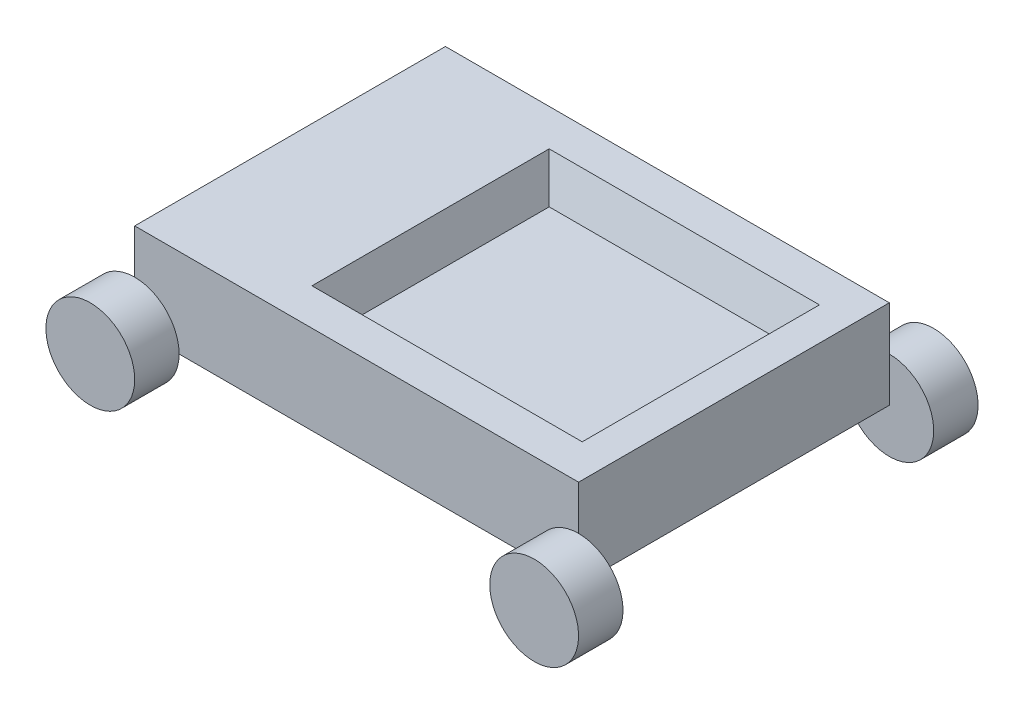
ISO-10303-21;
HEADER;
FILE_DESCRIPTION(('STEP AP214'),'2;1');
FILE_NAME('part.step','',(''),(''),'','','');
FILE_SCHEMA(('AUTOMOTIVE_DESIGN { 1 0 10303 214 1 1 1 1 }'));
ENDSEC;
DATA;
#1=APPLICATION_CONTEXT('core data for automotive mechanical design processes');
#2=APPLICATION_PROTOCOL_DEFINITION('international standard','automotive_design',2000,#1);
#3=PRODUCT_CONTEXT('',#1,'mechanical');
#4=PRODUCT('Part','Part','',(#3));
#5=PRODUCT_RELATED_PRODUCT_CATEGORY('part','',(#4));
#6=PRODUCT_DEFINITION_FORMATION('','',#4);
#7=PRODUCT_DEFINITION_CONTEXT('part definition',#1,'design');
#8=PRODUCT_DEFINITION('design','',#6,#7);
#9=PRODUCT_DEFINITION_SHAPE('','',#8);
#10=(LENGTH_UNIT() NAMED_UNIT(*) SI_UNIT(.MILLI.,.METRE.));
#11=(NAMED_UNIT(*) PLANE_ANGLE_UNIT() SI_UNIT($,.RADIAN.));
#12=(NAMED_UNIT(*) SI_UNIT($,.STERADIAN.) SOLID_ANGLE_UNIT());
#13=UNCERTAINTY_MEASURE_WITH_UNIT(LENGTH_MEASURE(1.E-05),#10,'distance_accuracy_value','');
#14=(GEOMETRIC_REPRESENTATION_CONTEXT(3) GLOBAL_UNCERTAINTY_ASSIGNED_CONTEXT((#13)) GLOBAL_UNIT_ASSIGNED_CONTEXT((#10,
#11,#12)) REPRESENTATION_CONTEXT('',''));
#15=CARTESIAN_POINT('',(0.,0.,0.));
#16=DIRECTION('',(0.,0.,1.));
#17=DIRECTION('',(1.,0.,0.));
#18=AXIS2_PLACEMENT_3D('',#15,#16,#17);
#19=CARTESIAN_POINT('',(-500.,200.,350.));
#20=DIRECTION('',(1.,0.,0.));
#21=DIRECTION('',(0.,0.,-1.));
#22=AXIS2_PLACEMENT_3D('',#19,#20,#21);
#23=PLANE('',#22);
#24=DIRECTION('',(0.,0.,1.));
#25=VECTOR('',#24,1.);
#26=CARTESIAN_POINT('',(-500.,0.,350.));
#27=LINE('',#26,#25);
#28=CARTESIAN_POINT('',(-500.,0.,-350.));
#29=VERTEX_POINT('',#28);
#30=CARTESIAN_POINT('',(-500.,0.,350.));
#31=VERTEX_POINT('',#30);
#32=EDGE_CURVE('E191',#29,#31,#27,.T.);
#33=ORIENTED_EDGE('',*,*,#32,.T.);
#34=DIRECTION('',(0.,-1.,0.));
#35=VECTOR('',#34,1.);
#36=CARTESIAN_POINT('',(-500.,200.,350.));
#37=LINE('',#36,#35);
#38=CARTESIAN_POINT('',(-500.,100.,350.));
#39=VERTEX_POINT('',#38);
#40=EDGE_CURVE('E42',#39,#31,#37,.T.);
#41=ORIENTED_EDGE('',*,*,#40,.F.);
#42=CARTESIAN_POINT('',(-500.,200.,350.));
#43=VERTEX_POINT('',#42);
#44=EDGE_CURVE('E11',#43,#39,#37,.T.);
#45=ORIENTED_EDGE('',*,*,#44,.F.);
#46=DIRECTION('',(0.,0.,1.));
#47=VECTOR('',#46,1.);
#48=CARTESIAN_POINT('',(-500.,200.,350.));
#49=LINE('',#48,#47);
#50=CARTESIAN_POINT('',(-500.,200.,-350.));
#51=VERTEX_POINT('',#50);
#52=EDGE_CURVE('E195',#51,#43,#49,.T.);
#53=ORIENTED_EDGE('',*,*,#52,.F.);
#54=DIRECTION('',(0.,-1.,0.));
#55=VECTOR('',#54,1.);
#56=CARTESIAN_POINT('',(-500.,200.,-350.));
#57=LINE('',#56,#55);
#58=CARTESIAN_POINT('',(-500.,100.,-350.));
#59=VERTEX_POINT('',#58);
#60=EDGE_CURVE('E219',#51,#59,#57,.T.);
#61=ORIENTED_EDGE('',*,*,#60,.T.);
#62=EDGE_CURVE('E205',#59,#29,#57,.T.);
#63=ORIENTED_EDGE('',*,*,#62,.T.);
#64=EDGE_LOOP('',(#33,#41,#45,#53,#61,#63));
#65=FACE_BOUND('',#64,.T.);
#66=ADVANCED_FACE('F35',(#65),#23,.F.);
#67=CARTESIAN_POINT('',(500.,200.,350.));
#68=DIRECTION('',(0.,0.,-1.));
#69=DIRECTION('',(-1.,0.,0.));
#70=AXIS2_PLACEMENT_3D('',#67,#68,#69);
#71=PLANE('',#70);
#72=DIRECTION('',(1.,0.,0.));
#73=VECTOR('',#72,1.);
#74=CARTESIAN_POINT('',(500.,0.,350.));
#75=LINE('',#74,#73);
#76=CARTESIAN_POINT('',(-400.,0.,350.));
#77=VERTEX_POINT('',#76);
#78=CARTESIAN_POINT('',(400.,0.,350.));
#79=VERTEX_POINT('',#78);
#80=EDGE_CURVE('E213',#77,#79,#75,.T.);
#81=ORIENTED_EDGE('',*,*,#80,.T.);
#82=CARTESIAN_POINT('',(500.,0.,350.));
#83=DIRECTION('',(0.,0.,-1.));
#84=DIRECTION('',(-1.,0.,0.));
#85=AXIS2_PLACEMENT_3D('',#82,#83,#84);
#86=CIRCLE('',#85,100.);
#87=CARTESIAN_POINT('',(500.,100.,350.));
#88=VERTEX_POINT('',#87);
#89=EDGE_CURVE('E183',#79,#88,#86,.T.);
#90=ORIENTED_EDGE('',*,*,#89,.T.);
#91=DIRECTION('',(0.,-1.,0.));
#92=VECTOR('',#91,1.);
#93=CARTESIAN_POINT('',(500.,200.,350.));
#94=LINE('',#93,#92);
#95=CARTESIAN_POINT('',(500.,200.,350.));
#96=VERTEX_POINT('',#95);
#97=EDGE_CURVE('E223',#96,#88,#94,.T.);
#98=ORIENTED_EDGE('',*,*,#97,.F.);
#99=DIRECTION('',(1.,0.,0.));
#100=VECTOR('',#99,1.);
#101=CARTESIAN_POINT('',(500.,200.,350.));
#102=LINE('',#101,#100);
#103=EDGE_CURVE('E198',#43,#96,#102,.T.);
#104=ORIENTED_EDGE('',*,*,#103,.F.);
#105=ORIENTED_EDGE('',*,*,#44,.T.);
#106=CARTESIAN_POINT('',(-500.,0.,350.));
#107=DIRECTION('',(0.,0.,1.));
#108=DIRECTION('',(1.,0.,0.));
#109=AXIS2_PLACEMENT_3D('',#106,#107,#108);
#110=CIRCLE('',#109,100.);
#111=EDGE_CURVE('E192',#77,#39,#110,.T.);
#112=ORIENTED_EDGE('',*,*,#111,.F.);
#113=EDGE_LOOP('',(#81,#90,#98,#104,#105,#112));
#114=FACE_BOUND('',#113,.T.);
#115=ADVANCED_FACE('F254',(#114),#71,.F.);
#116=CARTESIAN_POINT('',(500.,200.,350.));
#117=DIRECTION('',(-1.,0.,0.));
#118=DIRECTION('',(0.,0.,1.));
#119=AXIS2_PLACEMENT_3D('',#116,#117,#118);
#120=PLANE('',#119);
#121=DIRECTION('',(0.,0.,-1.));
#122=VECTOR('',#121,1.);
#123=CARTESIAN_POINT('',(500.,0.,350.));
#124=LINE('',#123,#122);
#125=CARTESIAN_POINT('',(500.,0.,350.));
#126=VERTEX_POINT('',#125);
#127=CARTESIAN_POINT('',(500.,0.,-350.));
#128=VERTEX_POINT('',#127);
#129=EDGE_CURVE('E212',#126,#128,#124,.T.);
#130=ORIENTED_EDGE('',*,*,#129,.T.);
#131=DIRECTION('',(0.,-1.,0.));
#132=VECTOR('',#131,1.);
#133=CARTESIAN_POINT('',(500.,200.,-350.));
#134=LINE('',#133,#132);
#135=CARTESIAN_POINT('',(500.,100.,-350.));
#136=VERTEX_POINT('',#135);
#137=EDGE_CURVE('E57',#136,#128,#134,.T.);
#138=ORIENTED_EDGE('',*,*,#137,.F.);
#139=DIRECTION('',(0.,-1.,0.));
#140=VECTOR('',#139,1.);
#141=CARTESIAN_POINT('',(500.,200.,-350.));
#142=LINE('',#141,#140);
#143=CARTESIAN_POINT('',(500.,200.,-350.));
#144=VERTEX_POINT('',#143);
#145=EDGE_CURVE('E222',#144,#136,#142,.T.);
#146=ORIENTED_EDGE('',*,*,#145,.F.);
#147=DIRECTION('',(0.,0.,-1.));
#148=VECTOR('',#147,1.);
#149=CARTESIAN_POINT('',(500.,200.,350.));
#150=LINE('',#149,#148);
#151=EDGE_CURVE('E201',#96,#144,#150,.T.);
#152=ORIENTED_EDGE('',*,*,#151,.F.);
#153=ORIENTED_EDGE('',*,*,#97,.T.);
#154=DIRECTION('',(0.,1.,0.));
#155=VECTOR('',#154,1.);
#156=CARTESIAN_POINT('',(500.,200.,350.));
#157=LINE('',#156,#155);
#158=EDGE_CURVE('E182',#126,#88,#157,.T.);
#159=ORIENTED_EDGE('',*,*,#158,.F.);
#160=EDGE_LOOP('',(#130,#138,#146,#152,#153,#159));
#161=FACE_BOUND('',#160,.T.);
#162=ADVANCED_FACE('F255',(#161),#120,.F.);
#163=CARTESIAN_POINT('',(500.,200.,-350.));
#164=DIRECTION('',(0.,0.,1.));
#165=DIRECTION('',(1.,0.,0.));
#166=AXIS2_PLACEMENT_3D('',#163,#164,#165);
#167=PLANE('',#166);
#168=CARTESIAN_POINT('',(500.,0.,-350.));
#169=DIRECTION('',(0.,0.,-1.));
#170=DIRECTION('',(-1.,0.,0.));
#171=AXIS2_PLACEMENT_3D('',#168,#169,#170);
#172=CIRCLE('',#171,100.);
#173=CARTESIAN_POINT('',(400.,0.,-350.));
#174=VERTEX_POINT('',#173);
#175=EDGE_CURVE('E167',#174,#136,#172,.T.);
#176=ORIENTED_EDGE('',*,*,#175,.F.);
#177=DIRECTION('',(-1.,0.,0.));
#178=VECTOR('',#177,1.);
#179=CARTESIAN_POINT('',(500.,0.,-350.));
#180=LINE('',#179,#178);
#181=CARTESIAN_POINT('',(-400.,0.,-350.));
#182=VERTEX_POINT('',#181);
#183=EDGE_CURVE('E218',#174,#182,#180,.T.);
#184=ORIENTED_EDGE('',*,*,#183,.T.);
#185=CARTESIAN_POINT('',(-500.,0.,-350.));
#186=DIRECTION('',(0.,0.,1.));
#187=DIRECTION('',(1.,0.,0.));
#188=AXIS2_PLACEMENT_3D('',#185,#186,#187);
#189=CIRCLE('',#188,100.);
#190=EDGE_CURVE('E176',#182,#59,#189,.T.);
#191=ORIENTED_EDGE('',*,*,#190,.T.);
#192=ORIENTED_EDGE('',*,*,#60,.F.);
#193=DIRECTION('',(-1.,0.,0.));
#194=VECTOR('',#193,1.);
#195=CARTESIAN_POINT('',(500.,200.,-350.));
#196=LINE('',#195,#194);
#197=EDGE_CURVE('E203',#144,#51,#196,.T.);
#198=ORIENTED_EDGE('',*,*,#197,.F.);
#199=ORIENTED_EDGE('',*,*,#145,.T.);
#200=EDGE_LOOP('',(#176,#184,#191,#192,#198,#199));
#201=FACE_BOUND('',#200,.T.);
#202=ADVANCED_FACE('F260',(#201),#167,.F.);
#203=CARTESIAN_POINT('',(0.,200.,0.));
#204=DIRECTION('',(0.,1.,0.));
#205=DIRECTION('',(0.,0.,1.));
#206=AXIS2_PLACEMENT_3D('',#203,#204,#205);
#207=PLANE('',#206);
#208=DIRECTION('',(0.,0.,-1.));
#209=VECTOR('',#208,1.);
#210=CARTESIAN_POINT('',(425.374279517427,200.,267.188219321885));
#211=LINE('',#210,#209);
#212=CARTESIAN_POINT('',(425.374279517427,200.,267.188219321885));
#213=VERTEX_POINT('',#212);
#214=CARTESIAN_POINT('',(425.374279517427,200.,-267.188219321885));
#215=VERTEX_POINT('',#214);
#216=EDGE_CURVE('E49',#213,#215,#211,.T.);
#217=ORIENTED_EDGE('',*,*,#216,.F.);
#218=DIRECTION('',(1.,0.,0.));
#219=VECTOR('',#218,1.);
#220=CARTESIAN_POINT('',(-183.44265804189,200.,267.188219321885));
#221=LINE('',#220,#219);
#222=CARTESIAN_POINT('',(-183.44265804189,200.,267.188219321885));
#223=VERTEX_POINT('',#222);
#224=EDGE_CURVE('E145',#223,#213,#221,.T.);
#225=ORIENTED_EDGE('',*,*,#224,.F.);
#226=DIRECTION('',(0.,0.,1.));
#227=VECTOR('',#226,1.);
#228=CARTESIAN_POINT('',(-183.44265804189,200.,267.188219321885));
#229=LINE('',#228,#227);
#230=CARTESIAN_POINT('',(-183.44265804189,200.,-267.188219321885));
#231=VERTEX_POINT('',#230);
#232=EDGE_CURVE('E127',#231,#223,#229,.T.);
#233=ORIENTED_EDGE('',*,*,#232,.F.);
#234=DIRECTION('',(-1.,0.,0.));
#235=VECTOR('',#234,1.);
#236=CARTESIAN_POINT('',(-183.44265804189,200.,-267.188219321885));
#237=LINE('',#236,#235);
#238=EDGE_CURVE('E138',#215,#231,#237,.T.);
#239=ORIENTED_EDGE('',*,*,#238,.F.);
#240=EDGE_LOOP('',(#217,#225,#233,#239));
#241=FACE_BOUND('',#240,.T.);
#242=ORIENTED_EDGE('',*,*,#52,.T.);
#243=ORIENTED_EDGE('',*,*,#103,.T.);
#244=ORIENTED_EDGE('',*,*,#151,.T.);
#245=ORIENTED_EDGE('',*,*,#197,.T.);
#246=EDGE_LOOP('',(#242,#243,#244,#245));
#247=FACE_BOUND('',#246,.T.);
#248=ADVANCED_FACE('F142',(#241,#247),#207,.T.);
#249=CARTESIAN_POINT('',(0.,0.,0.));
#250=DIRECTION('',(0.,1.,0.));
#251=DIRECTION('',(0.,0.,1.));
#252=AXIS2_PLACEMENT_3D('',#249,#250,#251);
#253=PLANE('',#252);
#254=ORIENTED_EDGE('',*,*,#32,.F.);
#255=EDGE_CURVE('E215',#182,#29,#180,.T.);
#256=ORIENTED_EDGE('',*,*,#255,.F.);
#257=ORIENTED_EDGE('',*,*,#183,.F.);
#258=EDGE_CURVE('E199',#128,#174,#180,.T.);
#259=ORIENTED_EDGE('',*,*,#258,.F.);
#260=ORIENTED_EDGE('',*,*,#129,.F.);
#261=EDGE_CURVE('E208',#79,#126,#75,.T.);
#262=ORIENTED_EDGE('',*,*,#261,.F.);
#263=ORIENTED_EDGE('',*,*,#80,.F.);
#264=EDGE_CURVE('E209',#31,#77,#75,.T.);
#265=ORIENTED_EDGE('',*,*,#264,.F.);
#266=EDGE_LOOP('',(#254,#256,#257,#259,#260,#262,#263,#265));
#267=FACE_BOUND('',#266,.T.);
#268=ADVANCED_FACE('F242',(#267),#253,.F.);
#269=CARTESIAN_POINT('',(-500.,0.,350.));
#270=DIRECTION('',(0.,0.,1.));
#271=DIRECTION('',(1.,0.,0.));
#272=AXIS2_PLACEMENT_3D('',#269,#270,#271);
#273=PLANE('',#272);
#274=ORIENTED_EDGE('',*,*,#40,.T.);
#275=ORIENTED_EDGE('',*,*,#264,.T.);
#276=EDGE_CURVE('E187',#39,#77,#110,.T.);
#277=ORIENTED_EDGE('',*,*,#276,.F.);
#278=EDGE_LOOP('',(#274,#275,#277));
#279=FACE_BOUND('',#278,.T.);
#280=ADVANCED_FACE('F232',(#279),#273,.F.);
#281=CARTESIAN_POINT('',(-500.,0.,450.));
#282=DIRECTION('',(0.,0.,-1.));
#283=DIRECTION('',(-1.,0.,0.));
#284=AXIS2_PLACEMENT_3D('',#281,#282,#283);
#285=CYLINDRICAL_SURFACE('',#284,100.);
#286=CARTESIAN_POINT('',(-500.,0.,450.));
#287=DIRECTION('',(0.,0.,1.));
#288=DIRECTION('',(1.,0.,0.));
#289=AXIS2_PLACEMENT_3D('',#286,#287,#288);
#290=CIRCLE('',#289,100.);
#291=CARTESIAN_POINT('',(-400.,0.,450.));
#292=VERTEX_POINT('',#291);
#293=EDGE_CURVE('E188',#292,#292,#290,.T.);
#294=ORIENTED_EDGE('',*,*,#293,.F.);
#295=EDGE_LOOP('',(#294));
#296=FACE_BOUND('',#295,.T.);
#297=ORIENTED_EDGE('',*,*,#111,.T.);
#298=ORIENTED_EDGE('',*,*,#276,.T.);
#299=EDGE_LOOP('',(#297,#298));
#300=FACE_BOUND('',#299,.T.);
#301=ADVANCED_FACE('F295',(#296,#300),#285,.T.);
#302=CARTESIAN_POINT('',(-500.,0.,450.));
#303=DIRECTION('',(0.,0.,1.));
#304=DIRECTION('',(1.,0.,0.));
#305=AXIS2_PLACEMENT_3D('',#302,#303,#304);
#306=PLANE('',#305);
#307=ORIENTED_EDGE('',*,*,#293,.T.);
#308=EDGE_LOOP('',(#307));
#309=FACE_BOUND('',#308,.T.);
#310=ADVANCED_FACE('F298',(#309),#306,.T.);
#311=CARTESIAN_POINT('',(500.,0.,350.));
#312=DIRECTION('',(0.,0.,1.));
#313=DIRECTION('',(-1.,0.,0.));
#314=AXIS2_PLACEMENT_3D('',#311,#312,#313);
#315=PLANE('',#314);
#316=ORIENTED_EDGE('',*,*,#261,.T.);
#317=ORIENTED_EDGE('',*,*,#158,.T.);
#318=EDGE_CURVE('E175',#88,#79,#86,.T.);
#319=ORIENTED_EDGE('',*,*,#318,.T.);
#320=EDGE_LOOP('',(#316,#317,#319));
#321=FACE_BOUND('',#320,.T.);
#322=ADVANCED_FACE('F249',(#321),#315,.F.);
#323=CARTESIAN_POINT('',(500.,0.,450.));
#324=DIRECTION('',(0.,0.,-1.));
#325=DIRECTION('',(-1.,0.,0.));
#326=AXIS2_PLACEMENT_3D('',#323,#324,#325);
#327=CYLINDRICAL_SURFACE('',#326,100.);
#328=CARTESIAN_POINT('',(500.,0.,450.));
#329=DIRECTION('',(0.,0.,-1.));
#330=DIRECTION('',(-1.,0.,0.));
#331=AXIS2_PLACEMENT_3D('',#328,#329,#330);
#332=CIRCLE('',#331,100.);
#333=CARTESIAN_POINT('',(400.,0.,450.));
#334=VERTEX_POINT('',#333);
#335=EDGE_CURVE('E179',#334,#334,#332,.T.);
#336=ORIENTED_EDGE('',*,*,#335,.T.);
#337=EDGE_LOOP('',(#336));
#338=FACE_BOUND('',#337,.T.);
#339=ORIENTED_EDGE('',*,*,#89,.F.);
#340=ORIENTED_EDGE('',*,*,#318,.F.);
#341=EDGE_LOOP('',(#339,#340));
#342=FACE_BOUND('',#341,.T.);
#343=ADVANCED_FACE('F253',(#338,#342),#327,.T.);
#344=CARTESIAN_POINT('',(500.,0.,450.));
#345=DIRECTION('',(0.,0.,1.));
#346=DIRECTION('',(-1.,0.,0.));
#347=AXIS2_PLACEMENT_3D('',#344,#345,#346);
#348=PLANE('',#347);
#349=ORIENTED_EDGE('',*,*,#335,.F.);
#350=EDGE_LOOP('',(#349));
#351=FACE_BOUND('',#350,.T.);
#352=ADVANCED_FACE('F268',(#351),#348,.T.);
#353=CARTESIAN_POINT('',(-500.,0.,-350.));
#354=DIRECTION('',(0.,0.,-1.));
#355=DIRECTION('',(1.,0.,0.));
#356=AXIS2_PLACEMENT_3D('',#353,#354,#355);
#357=PLANE('',#356);
#358=EDGE_CURVE('E171',#59,#182,#189,.T.);
#359=ORIENTED_EDGE('',*,*,#358,.T.);
#360=ORIENTED_EDGE('',*,*,#255,.T.);
#361=ORIENTED_EDGE('',*,*,#62,.F.);
#362=EDGE_LOOP('',(#359,#360,#361));
#363=FACE_BOUND('',#362,.T.);
#364=ADVANCED_FACE('F266',(#363),#357,.F.);
#365=CARTESIAN_POINT('',(-500.,0.,-450.));
#366=DIRECTION('',(0.,0.,1.));
#367=DIRECTION('',(1.,0.,0.));
#368=AXIS2_PLACEMENT_3D('',#365,#366,#367);
#369=CYLINDRICAL_SURFACE('',#368,100.);
#370=CARTESIAN_POINT('',(-500.,0.,-450.));
#371=DIRECTION('',(0.,0.,1.));
#372=DIRECTION('',(1.,0.,0.));
#373=AXIS2_PLACEMENT_3D('',#370,#371,#372);
#374=CIRCLE('',#373,100.);
#375=CARTESIAN_POINT('',(-400.,0.,-450.));
#376=VERTEX_POINT('',#375);
#377=EDGE_CURVE('E172',#376,#376,#374,.T.);
#378=ORIENTED_EDGE('',*,*,#377,.T.);
#379=EDGE_LOOP('',(#378));
#380=FACE_BOUND('',#379,.T.);
#381=ORIENTED_EDGE('',*,*,#190,.F.);
#382=ORIENTED_EDGE('',*,*,#358,.F.);
#383=EDGE_LOOP('',(#381,#382));
#384=FACE_BOUND('',#383,.T.);
#385=ADVANCED_FACE('F264',(#380,#384),#369,.T.);
#386=CARTESIAN_POINT('',(-500.,0.,-450.));
#387=DIRECTION('',(0.,0.,-1.));
#388=DIRECTION('',(1.,0.,0.));
#389=AXIS2_PLACEMENT_3D('',#386,#387,#388);
#390=PLANE('',#389);
#391=ORIENTED_EDGE('',*,*,#377,.F.);
#392=EDGE_LOOP('',(#391));
#393=FACE_BOUND('',#392,.T.);
#394=ADVANCED_FACE('F274',(#393),#390,.T.);
#395=CARTESIAN_POINT('',(500.,0.,-350.));
#396=DIRECTION('',(0.,0.,-1.));
#397=DIRECTION('',(-1.,0.,0.));
#398=AXIS2_PLACEMENT_3D('',#395,#396,#397);
#399=PLANE('',#398);
#400=EDGE_CURVE('E153',#136,#174,#172,.T.);
#401=ORIENTED_EDGE('',*,*,#400,.F.);
#402=ORIENTED_EDGE('',*,*,#137,.T.);
#403=ORIENTED_EDGE('',*,*,#258,.T.);
#404=EDGE_LOOP('',(#401,#402,#403));
#405=FACE_BOUND('',#404,.T.);
#406=ADVANCED_FACE('F365',(#405),#399,.F.);
#407=CARTESIAN_POINT('',(500.,0.,-450.));
#408=DIRECTION('',(0.,0.,1.));
#409=DIRECTION('',(1.,0.,0.));
#410=AXIS2_PLACEMENT_3D('',#407,#408,#409);
#411=CYLINDRICAL_SURFACE('',#410,100.);
#412=CARTESIAN_POINT('',(500.,0.,-450.));
#413=DIRECTION('',(0.,0.,-1.));
#414=DIRECTION('',(-1.,0.,0.));
#415=AXIS2_PLACEMENT_3D('',#412,#413,#414);
#416=CIRCLE('',#415,100.);
#417=CARTESIAN_POINT('',(400.,0.,-450.));
#418=VERTEX_POINT('',#417);
#419=EDGE_CURVE('E164',#418,#418,#416,.T.);
#420=ORIENTED_EDGE('',*,*,#419,.F.);
#421=EDGE_LOOP('',(#420));
#422=FACE_BOUND('',#421,.T.);
#423=ORIENTED_EDGE('',*,*,#175,.T.);
#424=ORIENTED_EDGE('',*,*,#400,.T.);
#425=EDGE_LOOP('',(#423,#424));
#426=FACE_BOUND('',#425,.T.);
#427=ADVANCED_FACE('F374',(#422,#426),#411,.T.);
#428=CARTESIAN_POINT('',(500.,0.,-450.));
#429=DIRECTION('',(0.,0.,-1.));
#430=DIRECTION('',(-1.,0.,0.));
#431=AXIS2_PLACEMENT_3D('',#428,#429,#430);
#432=PLANE('',#431);
#433=ORIENTED_EDGE('',*,*,#419,.T.);
#434=EDGE_LOOP('',(#433));
#435=FACE_BOUND('',#434,.T.);
#436=ADVANCED_FACE('F384',(#435),#432,.T.);
#437=CARTESIAN_POINT('',(425.374279517427,200.,267.188219321885));
#438=DIRECTION('',(0.939692620785908,-0.342020143325669,0.));
#439=DIRECTION('',(0.342020143325669,0.939692620785908,0.));
#440=AXIS2_PLACEMENT_3D('',#437,#438,#439);
#441=PLANE('',#440);
#442=ORIENTED_EDGE('',*,*,#216,.T.);
#443=DIRECTION('',(0.323615577118185,0.889126490715988,-0.323615577118185));
#444=VECTOR('',#443,1.);
#445=CARTESIAN_POINT('',(369.410615915475,46.2410979436826,-211.224555719933));
#446=LINE('',#445,#444);
#447=CARTESIAN_POINT('',(395.164750073332,117.,-236.97868987779));
#448=VERTEX_POINT('',#447);
#449=EDGE_CURVE('E135',#448,#215,#446,.T.);
#450=ORIENTED_EDGE('',*,*,#449,.F.);
#451=DIRECTION('',(0.,0.,-1.));
#452=VECTOR('',#451,1.);
#453=CARTESIAN_POINT('',(395.164750073332,117.,267.188219321885));
#454=LINE('',#453,#452);
#455=CARTESIAN_POINT('',(395.164750073332,117.,236.97868987779));
#456=VERTEX_POINT('',#455);
#457=EDGE_CURVE('E147',#456,#448,#454,.T.);
#458=ORIENTED_EDGE('',*,*,#457,.F.);
#459=DIRECTION('',(0.323615577118185,0.889126490715988,0.323615577118185));
#460=VECTOR('',#459,1.);
#461=CARTESIAN_POINT('',(361.614682677392,24.821947408475,203.42862248185));
#462=LINE('',#461,#460);
#463=EDGE_CURVE('E151',#456,#213,#462,.T.);
#464=ORIENTED_EDGE('',*,*,#463,.T.);
#465=EDGE_LOOP('',(#442,#450,#458,#464));
#466=FACE_BOUND('',#465,.T.);
#467=ADVANCED_FACE('F394',(#466),#441,.F.);
#468=CARTESIAN_POINT('',(-183.44265804189,200.,267.188219321885));
#469=DIRECTION('',(0.,-0.342020143325669,0.939692620785908));
#470=DIRECTION('',(0.,-0.939692620785908,-0.342020143325669));
#471=AXIS2_PLACEMENT_3D('',#468,#469,#470);
#472=PLANE('',#471);
#473=ORIENTED_EDGE('',*,*,#224,.T.);
#474=ORIENTED_EDGE('',*,*,#463,.F.);
#475=DIRECTION('',(1.,0.,0.));
#476=VECTOR('',#475,1.);
#477=CARTESIAN_POINT('',(-183.44265804189,117.,236.97868987779));
#478=LINE('',#477,#476);
#479=CARTESIAN_POINT('',(-153.233128597796,117.,236.97868987779));
#480=VERTEX_POINT('',#479);
#481=EDGE_CURVE('E154',#480,#456,#478,.T.);
#482=ORIENTED_EDGE('',*,*,#481,.F.);
#483=DIRECTION('',(-0.323615577118185,0.889126490715988,0.323615577118185));
#484=VECTOR('',#483,1.);
#485=CARTESIAN_POINT('',(-183.44265804189,200.,267.188219321885));
#486=LINE('',#485,#484);
#487=EDGE_CURVE('E134',#480,#223,#486,.T.);
#488=ORIENTED_EDGE('',*,*,#487,.T.);
#489=EDGE_LOOP('',(#473,#474,#482,#488));
#490=FACE_BOUND('',#489,.T.);
#491=ADVANCED_FACE('F409',(#490),#472,.F.);
#492=CARTESIAN_POINT('',(-183.44265804189,200.,267.188219321885));
#493=DIRECTION('',(-0.939692620785908,-0.342020143325669,0.));
#494=DIRECTION('',(0.342020143325669,-0.939692620785908,0.));
#495=AXIS2_PLACEMENT_3D('',#492,#493,#494);
#496=PLANE('',#495);
#497=ORIENTED_EDGE('',*,*,#232,.T.);
#498=ORIENTED_EDGE('',*,*,#487,.F.);
#499=DIRECTION('',(0.,0.,1.));
#500=VECTOR('',#499,1.);
#501=CARTESIAN_POINT('',(-153.233128597796,117.,267.188219321885));
#502=LINE('',#501,#500);
#503=CARTESIAN_POINT('',(-153.233128597796,117.,-236.97868987779));
#504=VERTEX_POINT('',#503);
#505=EDGE_CURVE('E130',#504,#480,#502,.T.);
#506=ORIENTED_EDGE('',*,*,#505,.F.);
#507=DIRECTION('',(-0.323615577118185,0.889126490715988,-0.323615577118185));
#508=VECTOR('',#507,1.);
#509=CARTESIAN_POINT('',(-183.44265804189,200.,-267.188219321885));
#510=LINE('',#509,#508);
#511=EDGE_CURVE('E123',#504,#231,#510,.T.);
#512=ORIENTED_EDGE('',*,*,#511,.T.);
#513=EDGE_LOOP('',(#497,#498,#506,#512));
#514=FACE_BOUND('',#513,.T.);
#515=ADVANCED_FACE('F125',(#514),#496,.F.);
#516=CARTESIAN_POINT('',(-183.44265804189,200.,-267.188219321885));
#517=DIRECTION('',(0.,-0.342020143325669,-0.939692620785908));
#518=DIRECTION('',(0.,0.939692620785908,-0.342020143325669));
#519=AXIS2_PLACEMENT_3D('',#516,#517,#518);
#520=PLANE('',#519);
#521=ORIENTED_EDGE('',*,*,#238,.T.);
#522=ORIENTED_EDGE('',*,*,#511,.F.);
#523=DIRECTION('',(-1.,0.,0.));
#524=VECTOR('',#523,1.);
#525=CARTESIAN_POINT('',(-183.44265804189,117.,-236.97868987779));
#526=LINE('',#525,#524);
#527=EDGE_CURVE('E159',#448,#504,#526,.T.);
#528=ORIENTED_EDGE('',*,*,#527,.F.);
#529=ORIENTED_EDGE('',*,*,#449,.T.);
#530=EDGE_LOOP('',(#521,#522,#528,#529));
#531=FACE_BOUND('',#530,.T.);
#532=ADVANCED_FACE('F139',(#531),#520,.F.);
#533=CARTESIAN_POINT('',(0.,117.,0.));
#534=DIRECTION('',(0.,-1.,0.));
#535=DIRECTION('',(0.,0.,-1.));
#536=AXIS2_PLACEMENT_3D('',#533,#534,#535);
#537=PLANE('',#536);
#538=ORIENTED_EDGE('',*,*,#457,.T.);
#539=ORIENTED_EDGE('',*,*,#527,.T.);
#540=ORIENTED_EDGE('',*,*,#505,.T.);
#541=ORIENTED_EDGE('',*,*,#481,.T.);
#542=EDGE_LOOP('',(#538,#539,#540,#541));
#543=FACE_BOUND('',#542,.T.);
#544=ADVANCED_FACE('F435',(#543),#537,.F.);
#545=CLOSED_SHELL('',(#66,#115,#162,#202,#248,#268,#280,#301,#310,#322,#343,#352,#364,#385,#394,
#406,#427,#436,#467,#491,#515,#532,#544));
#546=MANIFOLD_SOLID_BREP('B2',#545);
#547=ADVANCED_BREP_SHAPE_REPRESENTATION('',(#18,#546),#14);
#548=SHAPE_DEFINITION_REPRESENTATION(#9,#547);
ENDSEC;
END-ISO-10303-21;
